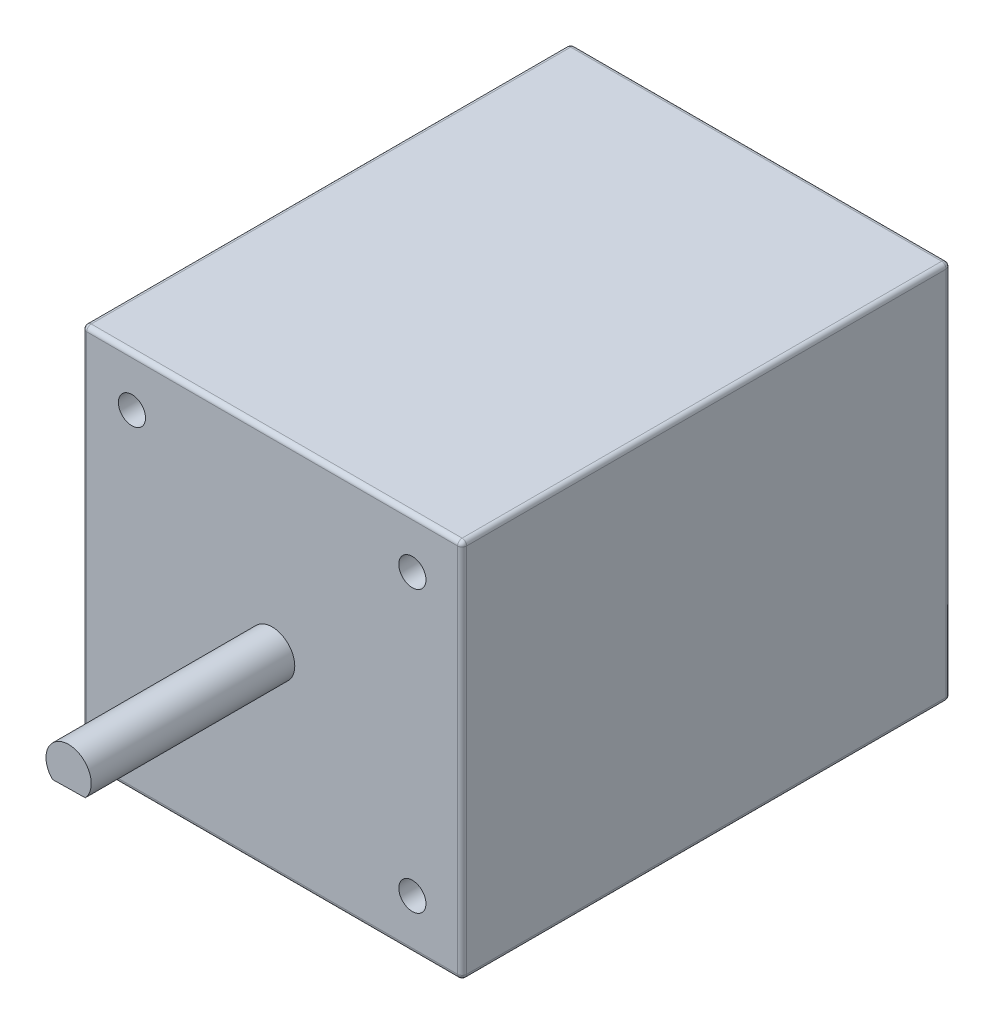
ISO-10303-21;
HEADER;
FILE_DESCRIPTION(('STEP AP214'),'2;1');
FILE_NAME('part.step','',(''),(''),'','','');
FILE_SCHEMA(('AUTOMOTIVE_DESIGN { 1 0 10303 214 1 1 1 1 }'));
ENDSEC;
DATA;
#1=APPLICATION_CONTEXT('core data for automotive mechanical design processes');
#2=APPLICATION_PROTOCOL_DEFINITION('international standard','automotive_design',2000,#1);
#3=PRODUCT_CONTEXT('',#1,'mechanical');
#4=PRODUCT('Part','Part','',(#3));
#5=PRODUCT_RELATED_PRODUCT_CATEGORY('part','',(#4));
#6=PRODUCT_DEFINITION_FORMATION('','',#4);
#7=PRODUCT_DEFINITION_CONTEXT('part definition',#1,'design');
#8=PRODUCT_DEFINITION('design','',#6,#7);
#9=PRODUCT_DEFINITION_SHAPE('','',#8);
#10=(LENGTH_UNIT() NAMED_UNIT(*) SI_UNIT(.MILLI.,.METRE.));
#11=(NAMED_UNIT(*) PLANE_ANGLE_UNIT() SI_UNIT($,.RADIAN.));
#12=(NAMED_UNIT(*) SI_UNIT($,.STERADIAN.) SOLID_ANGLE_UNIT());
#13=UNCERTAINTY_MEASURE_WITH_UNIT(LENGTH_MEASURE(1.E-05),#10,'distance_accuracy_value','');
#14=(GEOMETRIC_REPRESENTATION_CONTEXT(3) GLOBAL_UNCERTAINTY_ASSIGNED_CONTEXT((#13)) GLOBAL_UNIT_ASSIGNED_CONTEXT((#10,
#11,#12)) REPRESENTATION_CONTEXT('',''));
#15=CARTESIAN_POINT('',(0.,0.,0.));
#16=DIRECTION('',(0.,0.,1.));
#17=DIRECTION('',(1.,0.,0.));
#18=AXIS2_PLACEMENT_3D('',#15,#16,#17);
#19=CARTESIAN_POINT('',(21.,-21.,54.));
#20=DIRECTION('',(-1.,0.,0.));
#21=DIRECTION('',(0.,0.,1.));
#22=AXIS2_PLACEMENT_3D('',#19,#20,#21);
#23=PLANE('',#22);
#24=DIRECTION('',(0.,1.,0.));
#25=VECTOR('',#24,1.);
#26=CARTESIAN_POINT('',(21.,-21.,53.5));
#27=LINE('',#26,#25);
#28=CARTESIAN_POINT('',(21.,20.5,53.5));
#29=VERTEX_POINT('',#28);
#30=CARTESIAN_POINT('',(21.,-20.5,53.5));
#31=VERTEX_POINT('',#30);
#32=EDGE_CURVE('E182',#29,#31,#27,.F.);
#33=ORIENTED_EDGE('',*,*,#32,.T.);
#34=DIRECTION('',(0.,0.,-1.));
#35=VECTOR('',#34,1.);
#36=CARTESIAN_POINT('',(21.,-20.5,54.));
#37=LINE('',#36,#35);
#38=CARTESIAN_POINT('',(21.,-20.5,0.5));
#39=VERTEX_POINT('',#38);
#40=EDGE_CURVE('E185',#31,#39,#37,.T.);
#41=ORIENTED_EDGE('',*,*,#40,.T.);
#42=DIRECTION('',(0.,1.,0.));
#43=VECTOR('',#42,1.);
#44=CARTESIAN_POINT('',(21.,21.,0.5));
#45=LINE('',#44,#43);
#46=CARTESIAN_POINT('',(21.,20.5,0.5));
#47=VERTEX_POINT('',#46);
#48=EDGE_CURVE('E180',#39,#47,#45,.T.);
#49=ORIENTED_EDGE('',*,*,#48,.T.);
#50=DIRECTION('',(0.,0.,-1.));
#51=VECTOR('',#50,1.);
#52=CARTESIAN_POINT('',(21.,20.5,54.));
#53=LINE('',#52,#51);
#54=EDGE_CURVE('E178',#47,#29,#53,.F.);
#55=ORIENTED_EDGE('',*,*,#54,.T.);
#56=EDGE_LOOP('',(#33,#41,#49,#55));
#57=FACE_BOUND('',#56,.T.);
#58=ADVANCED_FACE('F41',(#57),#23,.F.);
#59=CARTESIAN_POINT('',(-21.,21.,54.));
#60=DIRECTION('',(0.,-1.,0.));
#61=DIRECTION('',(0.,0.,-1.));
#62=AXIS2_PLACEMENT_3D('',#59,#60,#61);
#63=PLANE('',#62);
#64=DIRECTION('',(-1.,0.,0.));
#65=VECTOR('',#64,1.);
#66=CARTESIAN_POINT('',(-21.,21.,53.5));
#67=LINE('',#66,#65);
#68=CARTESIAN_POINT('',(-20.5,21.,53.5));
#69=VERTEX_POINT('',#68);
#70=CARTESIAN_POINT('',(20.5,21.,53.5));
#71=VERTEX_POINT('',#70);
#72=EDGE_CURVE('E50',#69,#71,#67,.F.);
#73=ORIENTED_EDGE('',*,*,#72,.T.);
#74=DIRECTION('',(0.,0.,-1.));
#75=VECTOR('',#74,1.);
#76=CARTESIAN_POINT('',(20.5,21.,54.));
#77=LINE('',#76,#75);
#78=CARTESIAN_POINT('',(20.5,21.,0.5));
#79=VERTEX_POINT('',#78);
#80=EDGE_CURVE('E11',#71,#79,#77,.T.);
#81=ORIENTED_EDGE('',*,*,#80,.T.);
#82=DIRECTION('',(-1.,0.,0.));
#83=VECTOR('',#82,1.);
#84=CARTESIAN_POINT('',(-21.,21.,0.5));
#85=LINE('',#84,#83);
#86=CARTESIAN_POINT('',(-20.5,21.,0.5));
#87=VERTEX_POINT('',#86);
#88=EDGE_CURVE('E214',#79,#87,#85,.T.);
#89=ORIENTED_EDGE('',*,*,#88,.T.);
#90=DIRECTION('',(0.,0.,-1.));
#91=VECTOR('',#90,1.);
#92=CARTESIAN_POINT('',(-20.5,21.,54.));
#93=LINE('',#92,#91);
#94=EDGE_CURVE('E61',#87,#69,#93,.F.);
#95=ORIENTED_EDGE('',*,*,#94,.T.);
#96=EDGE_LOOP('',(#73,#81,#89,#95));
#97=FACE_BOUND('',#96,.T.);
#98=ADVANCED_FACE('F364',(#97),#63,.F.);
#99=CARTESIAN_POINT('',(-21.,-21.,54.));
#100=DIRECTION('',(1.,0.,0.));
#101=DIRECTION('',(0.,0.,-1.));
#102=AXIS2_PLACEMENT_3D('',#99,#100,#101);
#103=PLANE('',#102);
#104=DIRECTION('',(0.,0.,-1.));
#105=VECTOR('',#104,1.);
#106=CARTESIAN_POINT('',(-21.,-20.5,54.));
#107=LINE('',#106,#105);
#108=CARTESIAN_POINT('',(-21.,-20.5,0.5));
#109=VERTEX_POINT('',#108);
#110=CARTESIAN_POINT('',(-21.,-20.5,53.5));
#111=VERTEX_POINT('',#110);
#112=EDGE_CURVE('E209',#109,#111,#107,.F.);
#113=ORIENTED_EDGE('',*,*,#112,.T.);
#114=DIRECTION('',(0.,-1.,0.));
#115=VECTOR('',#114,1.);
#116=CARTESIAN_POINT('',(-21.,-21.,53.5));
#117=LINE('',#116,#115);
#118=CARTESIAN_POINT('',(-21.,20.5,53.5));
#119=VERTEX_POINT('',#118);
#120=EDGE_CURVE('E211',#111,#119,#117,.F.);
#121=ORIENTED_EDGE('',*,*,#120,.T.);
#122=DIRECTION('',(0.,0.,-1.));
#123=VECTOR('',#122,1.);
#124=CARTESIAN_POINT('',(-21.,20.5,54.));
#125=LINE('',#124,#123);
#126=CARTESIAN_POINT('',(-21.,20.5,0.5));
#127=VERTEX_POINT('',#126);
#128=EDGE_CURVE('E205',#119,#127,#125,.T.);
#129=ORIENTED_EDGE('',*,*,#128,.T.);
#130=DIRECTION('',(0.,-1.,0.));
#131=VECTOR('',#130,1.);
#132=CARTESIAN_POINT('',(-21.,-21.,0.5));
#133=LINE('',#132,#131);
#134=EDGE_CURVE('E207',#127,#109,#133,.T.);
#135=ORIENTED_EDGE('',*,*,#134,.T.);
#136=EDGE_LOOP('',(#113,#121,#129,#135));
#137=FACE_BOUND('',#136,.T.);
#138=ADVANCED_FACE('F310',(#137),#103,.F.);
#139=CARTESIAN_POINT('',(-21.,-21.,54.));
#140=DIRECTION('',(0.,1.,0.));
#141=DIRECTION('',(0.,0.,1.));
#142=AXIS2_PLACEMENT_3D('',#139,#140,#141);
#143=PLANE('',#142);
#144=DIRECTION('',(0.,0.,-1.));
#145=VECTOR('',#144,1.);
#146=CARTESIAN_POINT('',(20.5,-21.,54.));
#147=LINE('',#146,#145);
#148=CARTESIAN_POINT('',(20.5,-21.,0.5));
#149=VERTEX_POINT('',#148);
#150=CARTESIAN_POINT('',(20.5,-21.,53.5));
#151=VERTEX_POINT('',#150);
#152=EDGE_CURVE('E200',#149,#151,#147,.F.);
#153=ORIENTED_EDGE('',*,*,#152,.T.);
#154=DIRECTION('',(1.,0.,0.));
#155=VECTOR('',#154,1.);
#156=CARTESIAN_POINT('',(-21.,-21.,53.5));
#157=LINE('',#156,#155);
#158=CARTESIAN_POINT('',(-20.5,-21.,53.5));
#159=VERTEX_POINT('',#158);
#160=EDGE_CURVE('E202',#151,#159,#157,.F.);
#161=ORIENTED_EDGE('',*,*,#160,.T.);
#162=DIRECTION('',(0.,0.,-1.));
#163=VECTOR('',#162,1.);
#164=CARTESIAN_POINT('',(-20.5,-21.,54.));
#165=LINE('',#164,#163);
#166=CARTESIAN_POINT('',(-20.5,-21.,0.5));
#167=VERTEX_POINT('',#166);
#168=EDGE_CURVE('E196',#159,#167,#165,.T.);
#169=ORIENTED_EDGE('',*,*,#168,.T.);
#170=DIRECTION('',(1.,0.,0.));
#171=VECTOR('',#170,1.);
#172=CARTESIAN_POINT('',(21.,-21.,0.5));
#173=LINE('',#172,#171);
#174=EDGE_CURVE('E198',#167,#149,#173,.T.);
#175=ORIENTED_EDGE('',*,*,#174,.T.);
#176=EDGE_LOOP('',(#153,#161,#169,#175));
#177=FACE_BOUND('',#176,.T.);
#178=ADVANCED_FACE('F301',(#177),#143,.F.);
#179=CARTESIAN_POINT('',(0.,0.,54.));
#180=DIRECTION('',(0.,0.,-1.));
#181=DIRECTION('',(-1.,0.,0.));
#182=AXIS2_PLACEMENT_3D('',#179,#180,#181);
#183=PLANE('',#182);
#184=CARTESIAN_POINT('',(-15.5000000000002,-15.4999999999998,54.));
#185=DIRECTION('',(0.,0.,-1.));
#186=DIRECTION('',(-1.,0.,0.));
#187=AXIS2_PLACEMENT_3D('',#184,#185,#186);
#188=CIRCLE('',#187,1.5);
#189=CARTESIAN_POINT('',(-17.0000000000002,-15.4999999999998,54.));
#190=VERTEX_POINT('',#189);
#191=EDGE_CURVE('E691',#190,#190,#188,.T.);
#192=ORIENTED_EDGE('',*,*,#191,.T.);
#193=EDGE_LOOP('',(#192));
#194=FACE_BOUND('',#193,.T.);
#195=CARTESIAN_POINT('',(15.4999999999999,-15.5000000000001,54.));
#196=DIRECTION('',(0.,0.,-1.));
#197=DIRECTION('',(-1.,0.,0.));
#198=AXIS2_PLACEMENT_3D('',#195,#196,#197);
#199=CIRCLE('',#198,1.5);
#200=CARTESIAN_POINT('',(13.9999999999999,-15.5000000000001,54.));
#201=VERTEX_POINT('',#200);
#202=EDGE_CURVE('E708',#201,#201,#199,.T.);
#203=ORIENTED_EDGE('',*,*,#202,.T.);
#204=EDGE_LOOP('',(#203));
#205=FACE_BOUND('',#204,.T.);
#206=CARTESIAN_POINT('',(15.5000000000001,15.4999999999999,54.));
#207=DIRECTION('',(0.,0.,-1.));
#208=DIRECTION('',(-1.,0.,0.));
#209=AXIS2_PLACEMENT_3D('',#206,#207,#208);
#210=CIRCLE('',#209,1.5);
#211=CARTESIAN_POINT('',(14.0000000000001,15.4999999999999,54.));
#212=VERTEX_POINT('',#211);
#213=EDGE_CURVE('E699',#212,#212,#210,.T.);
#214=ORIENTED_EDGE('',*,*,#213,.T.);
#215=EDGE_LOOP('',(#214));
#216=FACE_BOUND('',#215,.T.);
#217=CARTESIAN_POINT('',(-15.5,15.5,54.));
#218=DIRECTION('',(0.,0.,-1.));
#219=DIRECTION('',(-1.,0.,0.));
#220=AXIS2_PLACEMENT_3D('',#217,#218,#219);
#221=CIRCLE('',#220,1.5);
#222=CARTESIAN_POINT('',(-17.,15.5,54.));
#223=VERTEX_POINT('',#222);
#224=EDGE_CURVE('E164',#223,#223,#221,.T.);
#225=ORIENTED_EDGE('',*,*,#224,.T.);
#226=EDGE_LOOP('',(#225));
#227=FACE_BOUND('',#226,.T.);
#228=DIRECTION('',(1.,0.,0.));
#229=VECTOR('',#228,1.);
#230=CARTESIAN_POINT('',(0.,-20.5,54.));
#231=LINE('',#230,#229);
#232=CARTESIAN_POINT('',(-20.5,-20.5,54.));
#233=VERTEX_POINT('',#232);
#234=CARTESIAN_POINT('',(20.5,-20.5,54.));
#235=VERTEX_POINT('',#234);
#236=EDGE_CURVE('E173',#233,#235,#231,.T.);
#237=ORIENTED_EDGE('',*,*,#236,.T.);
#238=DIRECTION('',(0.,1.,0.));
#239=VECTOR('',#238,1.);
#240=CARTESIAN_POINT('',(20.5,0.,54.));
#241=LINE('',#240,#239);
#242=CARTESIAN_POINT('',(20.5,20.5,54.));
#243=VERTEX_POINT('',#242);
#244=EDGE_CURVE('E175',#235,#243,#241,.T.);
#245=ORIENTED_EDGE('',*,*,#244,.T.);
#246=DIRECTION('',(-1.,0.,0.));
#247=VECTOR('',#246,1.);
#248=CARTESIAN_POINT('',(0.,20.5,54.));
#249=LINE('',#248,#247);
#250=CARTESIAN_POINT('',(-20.5,20.5,54.));
#251=VERTEX_POINT('',#250);
#252=EDGE_CURVE('E168',#243,#251,#249,.T.);
#253=ORIENTED_EDGE('',*,*,#252,.T.);
#254=DIRECTION('',(0.,-1.,0.));
#255=VECTOR('',#254,1.);
#256=CARTESIAN_POINT('',(-20.5,0.,54.));
#257=LINE('',#256,#255);
#258=EDGE_CURVE('E171',#251,#233,#257,.T.);
#259=ORIENTED_EDGE('',*,*,#258,.T.);
#260=EDGE_LOOP('',(#237,#245,#253,#259));
#261=FACE_BOUND('',#260,.T.);
#262=DIRECTION('',(0.99985468087506,0.0170474963626072,0.));
#263=VECTOR('',#262,1.);
#264=CARTESIAN_POINT('',(0.0293014268392263,-1.71856137454766,54.));
#265=LINE('',#264,#263);
#266=CARTESIAN_POINT('',(-1.78583780882188,-1.74950945141267,54.));
#267=VERTEX_POINT('',#266);
#268=CARTESIAN_POINT('',(1.84444066250034,-1.68761329768266,54.));
#269=VERTEX_POINT('',#268);
#270=EDGE_CURVE('E154',#267,#269,#265,.T.);
#271=ORIENTED_EDGE('',*,*,#270,.F.);
#272=CARTESIAN_POINT('',(0.,0.,54.));
#273=DIRECTION('',(0.,0.,-1.));
#274=DIRECTION('',(-1.,0.,0.));
#275=AXIS2_PLACEMENT_3D('',#272,#273,#274);
#276=CIRCLE('',#275,2.5);
#277=EDGE_CURVE('E161',#267,#269,#276,.T.);
#278=ORIENTED_EDGE('',*,*,#277,.T.);
#279=EDGE_LOOP('',(#271,#278));
#280=FACE_BOUND('',#279,.T.);
#281=ADVANCED_FACE('F408',(#194,#205,#216,#227,#261,#280),#183,.F.);
#282=CARTESIAN_POINT('',(0.,0.,0.));
#283=DIRECTION('',(0.,0.,-1.));
#284=DIRECTION('',(-1.,0.,0.));
#285=AXIS2_PLACEMENT_3D('',#282,#283,#284);
#286=PLANE('',#285);
#287=DIRECTION('',(-1.,0.,0.));
#288=VECTOR('',#287,1.);
#289=CARTESIAN_POINT('',(21.,20.5,0.));
#290=LINE('',#289,#288);
#291=CARTESIAN_POINT('',(-20.5,20.5,0.));
#292=VERTEX_POINT('',#291);
#293=CARTESIAN_POINT('',(20.5,20.5,0.));
#294=VERTEX_POINT('',#293);
#295=EDGE_CURVE('E187',#292,#294,#290,.F.);
#296=ORIENTED_EDGE('',*,*,#295,.T.);
#297=DIRECTION('',(0.,1.,0.));
#298=VECTOR('',#297,1.);
#299=CARTESIAN_POINT('',(20.5,-21.,0.));
#300=LINE('',#299,#298);
#301=CARTESIAN_POINT('',(20.5,-20.5,0.));
#302=VERTEX_POINT('',#301);
#303=EDGE_CURVE('E193',#294,#302,#300,.F.);
#304=ORIENTED_EDGE('',*,*,#303,.T.);
#305=DIRECTION('',(1.,0.,0.));
#306=VECTOR('',#305,1.);
#307=CARTESIAN_POINT('',(-21.,-20.5,0.));
#308=LINE('',#307,#306);
#309=CARTESIAN_POINT('',(-20.5,-20.5,0.));
#310=VERTEX_POINT('',#309);
#311=EDGE_CURVE('E191',#302,#310,#308,.F.);
#312=ORIENTED_EDGE('',*,*,#311,.T.);
#313=DIRECTION('',(0.,-1.,0.));
#314=VECTOR('',#313,1.);
#315=CARTESIAN_POINT('',(-20.5,21.,0.));
#316=LINE('',#315,#314);
#317=EDGE_CURVE('E189',#310,#292,#316,.F.);
#318=ORIENTED_EDGE('',*,*,#317,.T.);
#319=EDGE_LOOP('',(#296,#304,#312,#318));
#320=FACE_BOUND('',#319,.T.);
#321=ADVANCED_FACE('F330',(#320),#286,.T.);
#322=CARTESIAN_POINT('',(0.,0.,76.5));
#323=DIRECTION('',(0.,0.,-1.));
#324=DIRECTION('',(-1.,0.,0.));
#325=AXIS2_PLACEMENT_3D('',#322,#323,#324);
#326=CYLINDRICAL_SURFACE('',#325,2.5);
#327=ORIENTED_EDGE('',*,*,#277,.F.);
#328=DIRECTION('',(0.,0.,-1.));
#329=VECTOR('',#328,1.);
#330=CARTESIAN_POINT('',(-1.78583780882188,-1.74950945141267,76.5));
#331=LINE('',#330,#329);
#332=CARTESIAN_POINT('',(-1.78583780882188,-1.74950945141267,76.5));
#333=VERTEX_POINT('',#332);
#334=EDGE_CURVE('E157',#333,#267,#331,.T.);
#335=ORIENTED_EDGE('',*,*,#334,.F.);
#336=CARTESIAN_POINT('',(0.,0.,76.5));
#337=DIRECTION('',(0.,0.,-1.));
#338=DIRECTION('',(-1.,0.,0.));
#339=AXIS2_PLACEMENT_3D('',#336,#337,#338);
#340=CIRCLE('',#339,2.5);
#341=CARTESIAN_POINT('',(1.84444066250034,-1.68761329768266,76.5));
#342=VERTEX_POINT('',#341);
#343=EDGE_CURVE('E146',#333,#342,#340,.T.);
#344=ORIENTED_EDGE('',*,*,#343,.T.);
#345=DIRECTION('',(0.,0.,-1.));
#346=VECTOR('',#345,1.);
#347=CARTESIAN_POINT('',(1.84444066250034,-1.68761329768266,76.5));
#348=LINE('',#347,#346);
#349=EDGE_CURVE('E149',#342,#269,#348,.T.);
#350=ORIENTED_EDGE('',*,*,#349,.T.);
#351=EDGE_LOOP('',(#327,#335,#344,#350));
#352=FACE_BOUND('',#351,.T.);
#353=ADVANCED_FACE('F159',(#352),#326,.T.);
#354=CARTESIAN_POINT('',(0.0293014268392263,-1.71856137454766,76.5));
#355=DIRECTION('',(-0.0170474963626072,0.999854680875059,0.));
#356=DIRECTION('',(-0.99985468087506,-0.0170474963626072,0.));
#357=AXIS2_PLACEMENT_3D('',#354,#355,#356);
#358=PLANE('',#357);
#359=ORIENTED_EDGE('',*,*,#270,.T.);
#360=ORIENTED_EDGE('',*,*,#349,.F.);
#361=DIRECTION('',(0.99985468087506,0.0170474963626072,0.));
#362=VECTOR('',#361,1.);
#363=CARTESIAN_POINT('',(0.0293014268392263,-1.71856137454766,76.5));
#364=LINE('',#363,#362);
#365=EDGE_CURVE('E142',#333,#342,#364,.T.);
#366=ORIENTED_EDGE('',*,*,#365,.F.);
#367=ORIENTED_EDGE('',*,*,#334,.T.);
#368=EDGE_LOOP('',(#359,#360,#366,#367));
#369=FACE_BOUND('',#368,.T.);
#370=ADVANCED_FACE('F153',(#369),#358,.F.);
#371=CARTESIAN_POINT('',(0.,0.,76.5));
#372=DIRECTION('',(0.,0.,-1.));
#373=DIRECTION('',(-1.,0.,0.));
#374=AXIS2_PLACEMENT_3D('',#371,#372,#373);
#375=PLANE('',#374);
#376=ORIENTED_EDGE('',*,*,#343,.F.);
#377=ORIENTED_EDGE('',*,*,#365,.T.);
#378=EDGE_LOOP('',(#376,#377));
#379=FACE_BOUND('',#378,.T.);
#380=ADVANCED_FACE('F144',(#379),#375,.F.);
#381=CARTESIAN_POINT('',(-20.5,-21.,0.5));
#382=DIRECTION('',(0.,1.,0.));
#383=DIRECTION('',(0.,0.,1.));
#384=AXIS2_PLACEMENT_3D('',#381,#382,#383);
#385=CYLINDRICAL_SURFACE('',#384,0.5);
#386=CARTESIAN_POINT('',(-20.5,-20.5,0.5));
#387=DIRECTION('',(0.,-1.,0.));
#388=DIRECTION('',(0.,0.,-1.));
#389=AXIS2_PLACEMENT_3D('',#386,#387,#388);
#390=CIRCLE('',#389,0.5);
#391=EDGE_CURVE('E45',#109,#310,#390,.T.);
#392=ORIENTED_EDGE('',*,*,#391,.F.);
#393=ORIENTED_EDGE('',*,*,#134,.F.);
#394=CARTESIAN_POINT('',(-20.5,20.5,0.5));
#395=DIRECTION('',(0.,1.,0.));
#396=DIRECTION('',(-1.,0.,0.));
#397=AXIS2_PLACEMENT_3D('',#394,#395,#396);
#398=CIRCLE('',#397,0.5);
#399=EDGE_CURVE('E278',#292,#127,#398,.T.);
#400=ORIENTED_EDGE('',*,*,#399,.F.);
#401=ORIENTED_EDGE('',*,*,#317,.F.);
#402=EDGE_LOOP('',(#392,#393,#400,#401));
#403=FACE_BOUND('',#402,.T.);
#404=ADVANCED_FACE('F43',(#403),#385,.T.);
#405=CARTESIAN_POINT('',(-20.5,-20.5,0.5));
#406=DIRECTION('',(0.,0.,-1.));
#407=DIRECTION('',(-1.,0.,0.));
#408=AXIS2_PLACEMENT_3D('',#405,#406,#407);
#409=SPHERICAL_SURFACE('',#408,0.5);
#410=CARTESIAN_POINT('',(-20.5,-20.5,0.5));
#411=DIRECTION('',(0.,0.,-1.));
#412=DIRECTION('',(-1.,0.,0.));
#413=AXIS2_PLACEMENT_3D('',#410,#411,#412);
#414=CIRCLE('',#413,0.5);
#415=EDGE_CURVE('E273',#109,#167,#414,.F.);
#416=ORIENTED_EDGE('',*,*,#415,.F.);
#417=ORIENTED_EDGE('',*,*,#391,.T.);
#418=CARTESIAN_POINT('',(-20.5,-20.5,0.5));
#419=DIRECTION('',(-1.,0.,0.));
#420=DIRECTION('',(0.,0.,1.));
#421=AXIS2_PLACEMENT_3D('',#418,#419,#420);
#422=CIRCLE('',#421,0.5);
#423=EDGE_CURVE('E276',#167,#310,#422,.F.);
#424=ORIENTED_EDGE('',*,*,#423,.F.);
#425=EDGE_LOOP('',(#416,#417,#424));
#426=FACE_BOUND('',#425,.T.);
#427=ADVANCED_FACE('F289',(#426),#409,.T.);
#428=CARTESIAN_POINT('',(-20.5,20.5,0.5));
#429=DIRECTION('',(-1.,0.,0.));
#430=DIRECTION('',(0.,-1.,0.));
#431=AXIS2_PLACEMENT_3D('',#428,#429,#430);
#432=SPHERICAL_SURFACE('',#431,0.5);
#433=CARTESIAN_POINT('',(-20.5,20.5,0.5));
#434=DIRECTION('',(-1.,0.,0.));
#435=DIRECTION('',(0.,0.,1.));
#436=AXIS2_PLACEMENT_3D('',#433,#434,#435);
#437=CIRCLE('',#436,0.5);
#438=EDGE_CURVE('E267',#292,#87,#437,.F.);
#439=ORIENTED_EDGE('',*,*,#438,.F.);
#440=ORIENTED_EDGE('',*,*,#399,.T.);
#441=CARTESIAN_POINT('',(-20.5,20.5,0.5));
#442=DIRECTION('',(0.,0.,-1.));
#443=DIRECTION('',(-1.,0.,0.));
#444=AXIS2_PLACEMENT_3D('',#441,#442,#443);
#445=CIRCLE('',#444,0.5);
#446=EDGE_CURVE('E270',#87,#127,#445,.F.);
#447=ORIENTED_EDGE('',*,*,#446,.F.);
#448=EDGE_LOOP('',(#439,#440,#447));
#449=FACE_BOUND('',#448,.T.);
#450=ADVANCED_FACE('F323',(#449),#432,.T.);
#451=CARTESIAN_POINT('',(-21.,-20.5,0.5));
#452=DIRECTION('',(-1.,0.,0.));
#453=DIRECTION('',(0.,0.,1.));
#454=AXIS2_PLACEMENT_3D('',#451,#452,#453);
#455=CYLINDRICAL_SURFACE('',#454,0.5);
#456=ORIENTED_EDGE('',*,*,#423,.T.);
#457=ORIENTED_EDGE('',*,*,#311,.F.);
#458=CARTESIAN_POINT('',(20.5,-20.5,0.5));
#459=DIRECTION('',(1.,0.,0.));
#460=DIRECTION('',(0.,0.,-1.));
#461=AXIS2_PLACEMENT_3D('',#458,#459,#460);
#462=CIRCLE('',#461,0.5);
#463=EDGE_CURVE('E262',#149,#302,#462,.T.);
#464=ORIENTED_EDGE('',*,*,#463,.F.);
#465=ORIENTED_EDGE('',*,*,#174,.F.);
#466=EDGE_LOOP('',(#456,#457,#464,#465));
#467=FACE_BOUND('',#466,.T.);
#468=ADVANCED_FACE('F297',(#467),#455,.T.);
#469=CARTESIAN_POINT('',(-20.5,-20.5,54.));
#470=DIRECTION('',(0.,0.,-1.));
#471=DIRECTION('',(-1.,0.,0.));
#472=AXIS2_PLACEMENT_3D('',#469,#470,#471);
#473=CYLINDRICAL_SURFACE('',#472,0.5);
#474=ORIENTED_EDGE('',*,*,#415,.T.);
#475=ORIENTED_EDGE('',*,*,#168,.F.);
#476=CARTESIAN_POINT('',(-20.5,-20.5,53.5));
#477=DIRECTION('',(0.,0.,1.));
#478=DIRECTION('',(1.,0.,0.));
#479=AXIS2_PLACEMENT_3D('',#476,#477,#478);
#480=CIRCLE('',#479,0.5);
#481=EDGE_CURVE('E259',#111,#159,#480,.T.);
#482=ORIENTED_EDGE('',*,*,#481,.F.);
#483=ORIENTED_EDGE('',*,*,#112,.F.);
#484=EDGE_LOOP('',(#474,#475,#482,#483));
#485=FACE_BOUND('',#484,.T.);
#486=ADVANCED_FACE('F307',(#485),#473,.T.);
#487=CARTESIAN_POINT('',(-20.5,0.,53.5));
#488=DIRECTION('',(0.,-1.,0.));
#489=DIRECTION('',(0.,0.,-1.));
#490=AXIS2_PLACEMENT_3D('',#487,#488,#489);
#491=CYLINDRICAL_SURFACE('',#490,0.5);
#492=CARTESIAN_POINT('',(-20.5,20.5,53.5));
#493=DIRECTION('',(0.,1.,0.));
#494=DIRECTION('',(0.,0.,1.));
#495=AXIS2_PLACEMENT_3D('',#492,#493,#494);
#496=CIRCLE('',#495,0.5);
#497=EDGE_CURVE('E253',#119,#251,#496,.T.);
#498=ORIENTED_EDGE('',*,*,#497,.F.);
#499=ORIENTED_EDGE('',*,*,#120,.F.);
#500=CARTESIAN_POINT('',(-20.5,-20.5,53.5));
#501=DIRECTION('',(0.,-1.,0.));
#502=DIRECTION('',(0.,0.,-1.));
#503=AXIS2_PLACEMENT_3D('',#500,#501,#502);
#504=CIRCLE('',#503,0.5);
#505=EDGE_CURVE('E256',#233,#111,#504,.T.);
#506=ORIENTED_EDGE('',*,*,#505,.F.);
#507=ORIENTED_EDGE('',*,*,#258,.F.);
#508=EDGE_LOOP('',(#498,#499,#506,#507));
#509=FACE_BOUND('',#508,.T.);
#510=ADVANCED_FACE('F314',(#509),#491,.T.);
#511=CARTESIAN_POINT('',(-20.5,20.5,54.));
#512=DIRECTION('',(0.,0.,-1.));
#513=DIRECTION('',(-1.,0.,0.));
#514=AXIS2_PLACEMENT_3D('',#511,#512,#513);
#515=CYLINDRICAL_SURFACE('',#514,0.5);
#516=ORIENTED_EDGE('',*,*,#446,.T.);
#517=ORIENTED_EDGE('',*,*,#128,.F.);
#518=CARTESIAN_POINT('',(-20.5,20.5,53.5));
#519=DIRECTION('',(0.,0.,1.));
#520=DIRECTION('',(1.,0.,0.));
#521=AXIS2_PLACEMENT_3D('',#518,#519,#520);
#522=CIRCLE('',#521,0.5);
#523=EDGE_CURVE('E251',#69,#119,#522,.T.);
#524=ORIENTED_EDGE('',*,*,#523,.F.);
#525=ORIENTED_EDGE('',*,*,#94,.F.);
#526=EDGE_LOOP('',(#516,#517,#524,#525));
#527=FACE_BOUND('',#526,.T.);
#528=ADVANCED_FACE('F321',(#527),#515,.T.);
#529=CARTESIAN_POINT('',(-21.,20.5,0.5));
#530=DIRECTION('',(1.,0.,0.));
#531=DIRECTION('',(0.,0.,-1.));
#532=AXIS2_PLACEMENT_3D('',#529,#530,#531);
#533=CYLINDRICAL_SURFACE('',#532,0.5);
#534=ORIENTED_EDGE('',*,*,#438,.T.);
#535=ORIENTED_EDGE('',*,*,#88,.F.);
#536=CARTESIAN_POINT('',(20.5,20.5,0.5));
#537=DIRECTION('',(1.,0.,0.));
#538=DIRECTION('',(0.,0.,-1.));
#539=AXIS2_PLACEMENT_3D('',#536,#537,#538);
#540=CIRCLE('',#539,0.5);
#541=EDGE_CURVE('E248',#294,#79,#540,.T.);
#542=ORIENTED_EDGE('',*,*,#541,.F.);
#543=ORIENTED_EDGE('',*,*,#295,.F.);
#544=EDGE_LOOP('',(#534,#535,#542,#543));
#545=FACE_BOUND('',#544,.T.);
#546=ADVANCED_FACE('F327',(#545),#533,.T.);
#547=CARTESIAN_POINT('',(20.5,-21.,0.5));
#548=DIRECTION('',(0.,-1.,0.));
#549=DIRECTION('',(0.,0.,-1.));
#550=AXIS2_PLACEMENT_3D('',#547,#548,#549);
#551=CYLINDRICAL_SURFACE('',#550,0.5);
#552=CARTESIAN_POINT('',(20.5,-20.5,0.5));
#553=DIRECTION('',(0.,-1.,0.));
#554=DIRECTION('',(0.,0.,-1.));
#555=AXIS2_PLACEMENT_3D('',#552,#553,#554);
#556=CIRCLE('',#555,0.5);
#557=EDGE_CURVE('E264',#302,#39,#556,.T.);
#558=ORIENTED_EDGE('',*,*,#557,.F.);
#559=ORIENTED_EDGE('',*,*,#303,.F.);
#560=CARTESIAN_POINT('',(20.5,20.5,0.5));
#561=DIRECTION('',(0.,1.,0.));
#562=DIRECTION('',(0.,0.,1.));
#563=AXIS2_PLACEMENT_3D('',#560,#561,#562);
#564=CIRCLE('',#563,0.5);
#565=EDGE_CURVE('E245',#47,#294,#564,.T.);
#566=ORIENTED_EDGE('',*,*,#565,.F.);
#567=ORIENTED_EDGE('',*,*,#48,.F.);
#568=EDGE_LOOP('',(#558,#559,#566,#567));
#569=FACE_BOUND('',#568,.T.);
#570=ADVANCED_FACE('F334',(#569),#551,.T.);
#571=CARTESIAN_POINT('',(20.5,-20.5,0.5));
#572=DIRECTION('',(0.,0.,-1.));
#573=DIRECTION('',(-1.,0.,0.));
#574=AXIS2_PLACEMENT_3D('',#571,#572,#573);
#575=SPHERICAL_SURFACE('',#574,0.5);
#576=ORIENTED_EDGE('',*,*,#463,.T.);
#577=ORIENTED_EDGE('',*,*,#557,.T.);
#578=CARTESIAN_POINT('',(20.5,-20.5,0.5));
#579=DIRECTION('',(0.,0.,-1.));
#580=DIRECTION('',(-1.,0.,0.));
#581=AXIS2_PLACEMENT_3D('',#578,#579,#580);
#582=CIRCLE('',#581,0.5);
#583=EDGE_CURVE('E242',#149,#39,#582,.F.);
#584=ORIENTED_EDGE('',*,*,#583,.F.);
#585=EDGE_LOOP('',(#576,#577,#584));
#586=FACE_BOUND('',#585,.T.);
#587=ADVANCED_FACE('F338',(#586),#575,.T.);
#588=CARTESIAN_POINT('',(-20.5,-20.5,53.5));
#589=DIRECTION('',(-1.,0.,0.));
#590=DIRECTION('',(0.,0.,1.));
#591=AXIS2_PLACEMENT_3D('',#588,#589,#590);
#592=SPHERICAL_SURFACE('',#591,0.5);
#593=ORIENTED_EDGE('',*,*,#505,.T.);
#594=ORIENTED_EDGE('',*,*,#481,.T.);
#595=CARTESIAN_POINT('',(-20.5,-20.5,53.5));
#596=DIRECTION('',(-1.,0.,0.));
#597=DIRECTION('',(0.,0.,1.));
#598=AXIS2_PLACEMENT_3D('',#595,#596,#597);
#599=CIRCLE('',#598,0.5);
#600=EDGE_CURVE('E240',#233,#159,#599,.F.);
#601=ORIENTED_EDGE('',*,*,#600,.F.);
#602=EDGE_LOOP('',(#593,#594,#601));
#603=FACE_BOUND('',#602,.T.);
#604=ADVANCED_FACE('F352',(#603),#592,.T.);
#605=CARTESIAN_POINT('',(-20.5,20.5,53.5));
#606=DIRECTION('',(-1.,0.,0.));
#607=DIRECTION('',(0.,-1.,0.));
#608=AXIS2_PLACEMENT_3D('',#605,#606,#607);
#609=SPHERICAL_SURFACE('',#608,0.5);
#610=ORIENTED_EDGE('',*,*,#523,.T.);
#611=ORIENTED_EDGE('',*,*,#497,.T.);
#612=CARTESIAN_POINT('',(-20.5,20.5,53.5));
#613=DIRECTION('',(-1.,0.,0.));
#614=DIRECTION('',(0.,0.,1.));
#615=AXIS2_PLACEMENT_3D('',#612,#613,#614);
#616=CIRCLE('',#615,0.5);
#617=EDGE_CURVE('E237',#69,#251,#616,.F.);
#618=ORIENTED_EDGE('',*,*,#617,.F.);
#619=EDGE_LOOP('',(#610,#611,#618));
#620=FACE_BOUND('',#619,.T.);
#621=ADVANCED_FACE('F354',(#620),#609,.T.);
#622=CARTESIAN_POINT('',(20.5,20.5,0.5));
#623=DIRECTION('',(0.,0.,-1.));
#624=DIRECTION('',(-1.,0.,0.));
#625=AXIS2_PLACEMENT_3D('',#622,#623,#624);
#626=SPHERICAL_SURFACE('',#625,0.5);
#627=ORIENTED_EDGE('',*,*,#565,.T.);
#628=ORIENTED_EDGE('',*,*,#541,.T.);
#629=CARTESIAN_POINT('',(20.5,20.5,0.5));
#630=DIRECTION('',(0.,0.,-1.));
#631=DIRECTION('',(-1.,0.,0.));
#632=AXIS2_PLACEMENT_3D('',#629,#630,#631);
#633=CIRCLE('',#632,0.5);
#634=EDGE_CURVE('E235',#47,#79,#633,.F.);
#635=ORIENTED_EDGE('',*,*,#634,.F.);
#636=EDGE_LOOP('',(#627,#628,#635));
#637=FACE_BOUND('',#636,.T.);
#638=ADVANCED_FACE('F360',(#637),#626,.T.);
#639=CARTESIAN_POINT('',(20.5,-20.5,54.));
#640=DIRECTION('',(0.,0.,-1.));
#641=DIRECTION('',(-1.,0.,0.));
#642=AXIS2_PLACEMENT_3D('',#639,#640,#641);
#643=CYLINDRICAL_SURFACE('',#642,0.5);
#644=ORIENTED_EDGE('',*,*,#583,.T.);
#645=ORIENTED_EDGE('',*,*,#40,.F.);
#646=CARTESIAN_POINT('',(20.5,-20.5,53.5));
#647=DIRECTION('',(0.,0.,1.));
#648=DIRECTION('',(1.,0.,0.));
#649=AXIS2_PLACEMENT_3D('',#646,#647,#648);
#650=CIRCLE('',#649,0.5);
#651=EDGE_CURVE('E232',#151,#31,#650,.T.);
#652=ORIENTED_EDGE('',*,*,#651,.F.);
#653=ORIENTED_EDGE('',*,*,#152,.F.);
#654=EDGE_LOOP('',(#644,#645,#652,#653));
#655=FACE_BOUND('',#654,.T.);
#656=ADVANCED_FACE('F341',(#655),#643,.T.);
#657=CARTESIAN_POINT('',(0.,-20.5,53.5));
#658=DIRECTION('',(1.,0.,0.));
#659=DIRECTION('',(0.,0.,-1.));
#660=AXIS2_PLACEMENT_3D('',#657,#658,#659);
#661=CYLINDRICAL_SURFACE('',#660,0.5);
#662=ORIENTED_EDGE('',*,*,#600,.T.);
#663=ORIENTED_EDGE('',*,*,#160,.F.);
#664=CARTESIAN_POINT('',(20.5,-20.5,53.5));
#665=DIRECTION('',(1.,0.,0.));
#666=DIRECTION('',(0.,0.,-1.));
#667=AXIS2_PLACEMENT_3D('',#664,#665,#666);
#668=CIRCLE('',#667,0.5);
#669=EDGE_CURVE('E229',#235,#151,#668,.T.);
#670=ORIENTED_EDGE('',*,*,#669,.F.);
#671=ORIENTED_EDGE('',*,*,#236,.F.);
#672=EDGE_LOOP('',(#662,#663,#670,#671));
#673=FACE_BOUND('',#672,.T.);
#674=ADVANCED_FACE('F350',(#673),#661,.T.);
#675=CARTESIAN_POINT('',(0.,20.5,53.5));
#676=DIRECTION('',(-1.,0.,0.));
#677=DIRECTION('',(0.,0.,1.));
#678=AXIS2_PLACEMENT_3D('',#675,#676,#677);
#679=CYLINDRICAL_SURFACE('',#678,0.5);
#680=ORIENTED_EDGE('',*,*,#617,.T.);
#681=ORIENTED_EDGE('',*,*,#252,.F.);
#682=CARTESIAN_POINT('',(20.5,20.5,53.5));
#683=DIRECTION('',(1.,0.,0.));
#684=DIRECTION('',(0.,0.,-1.));
#685=AXIS2_PLACEMENT_3D('',#682,#683,#684);
#686=CIRCLE('',#685,0.5);
#687=EDGE_CURVE('E226',#71,#243,#686,.T.);
#688=ORIENTED_EDGE('',*,*,#687,.F.);
#689=ORIENTED_EDGE('',*,*,#72,.F.);
#690=EDGE_LOOP('',(#680,#681,#688,#689));
#691=FACE_BOUND('',#690,.T.);
#692=ADVANCED_FACE('F388',(#691),#679,.T.);
#693=CARTESIAN_POINT('',(20.5,20.5,54.));
#694=DIRECTION('',(0.,0.,-1.));
#695=DIRECTION('',(-1.,0.,0.));
#696=AXIS2_PLACEMENT_3D('',#693,#694,#695);
#697=CYLINDRICAL_SURFACE('',#696,0.5);
#698=ORIENTED_EDGE('',*,*,#634,.T.);
#699=ORIENTED_EDGE('',*,*,#80,.F.);
#700=CARTESIAN_POINT('',(20.5,20.5,53.5));
#701=DIRECTION('',(0.,0.,1.));
#702=DIRECTION('',(1.,0.,0.));
#703=AXIS2_PLACEMENT_3D('',#700,#701,#702);
#704=CIRCLE('',#703,0.5);
#705=EDGE_CURVE('E223',#29,#71,#704,.T.);
#706=ORIENTED_EDGE('',*,*,#705,.F.);
#707=ORIENTED_EDGE('',*,*,#54,.F.);
#708=EDGE_LOOP('',(#698,#699,#706,#707));
#709=FACE_BOUND('',#708,.T.);
#710=ADVANCED_FACE('F385',(#709),#697,.T.);
#711=CARTESIAN_POINT('',(20.5,-20.5,53.5));
#712=DIRECTION('',(0.,-1.,0.));
#713=DIRECTION('',(0.,0.,-1.));
#714=AXIS2_PLACEMENT_3D('',#711,#712,#713);
#715=SPHERICAL_SURFACE('',#714,0.5);
#716=ORIENTED_EDGE('',*,*,#669,.T.);
#717=ORIENTED_EDGE('',*,*,#651,.T.);
#718=CARTESIAN_POINT('',(20.5,-20.5,53.5));
#719=DIRECTION('',(0.,-1.,0.));
#720=DIRECTION('',(0.,0.,-1.));
#721=AXIS2_PLACEMENT_3D('',#718,#719,#720);
#722=CIRCLE('',#721,0.5);
#723=EDGE_CURVE('E220',#235,#31,#722,.F.);
#724=ORIENTED_EDGE('',*,*,#723,.F.);
#725=EDGE_LOOP('',(#716,#717,#724));
#726=FACE_BOUND('',#725,.T.);
#727=ADVANCED_FACE('F346',(#726),#715,.T.);
#728=CARTESIAN_POINT('',(20.5,20.5,53.5));
#729=DIRECTION('',(0.,1.,0.));
#730=DIRECTION('',(0.,0.,1.));
#731=AXIS2_PLACEMENT_3D('',#728,#729,#730);
#732=SPHERICAL_SURFACE('',#731,0.5);
#733=ORIENTED_EDGE('',*,*,#705,.T.);
#734=ORIENTED_EDGE('',*,*,#687,.T.);
#735=CARTESIAN_POINT('',(20.5,20.5,53.5));
#736=DIRECTION('',(0.,1.,0.));
#737=DIRECTION('',(0.,0.,1.));
#738=AXIS2_PLACEMENT_3D('',#735,#736,#737);
#739=CIRCLE('',#738,0.5);
#740=EDGE_CURVE('E218',#29,#243,#739,.F.);
#741=ORIENTED_EDGE('',*,*,#740,.F.);
#742=EDGE_LOOP('',(#733,#734,#741));
#743=FACE_BOUND('',#742,.T.);
#744=ADVANCED_FACE('F378',(#743),#732,.T.);
#745=CARTESIAN_POINT('',(20.5,0.,53.5));
#746=DIRECTION('',(0.,1.,0.));
#747=DIRECTION('',(0.,0.,1.));
#748=AXIS2_PLACEMENT_3D('',#745,#746,#747);
#749=CYLINDRICAL_SURFACE('',#748,0.5);
#750=ORIENTED_EDGE('',*,*,#723,.T.);
#751=ORIENTED_EDGE('',*,*,#32,.F.);
#752=ORIENTED_EDGE('',*,*,#740,.T.);
#753=ORIENTED_EDGE('',*,*,#244,.F.);
#754=EDGE_LOOP('',(#750,#751,#752,#753));
#755=FACE_BOUND('',#754,.T.);
#756=ADVANCED_FACE('F374',(#755),#749,.T.);
#757=CARTESIAN_POINT('',(-15.5,15.5,44.));
#758=DIRECTION('',(0.,0.,1.));
#759=DIRECTION('',(1.,0.,0.));
#760=AXIS2_PLACEMENT_3D('',#757,#758,#759);
#761=CYLINDRICAL_SURFACE('',#760,1.5);
#762=CARTESIAN_POINT('',(-15.5,15.5,44.));
#763=DIRECTION('',(0.,0.,-1.));
#764=DIRECTION('',(-1.,0.,0.));
#765=AXIS2_PLACEMENT_3D('',#762,#763,#764);
#766=CIRCLE('',#765,1.5);
#767=CARTESIAN_POINT('',(-17.,15.5,44.));
#768=VERTEX_POINT('',#767);
#769=EDGE_CURVE('E221',#768,#768,#766,.T.);
#770=ORIENTED_EDGE('',*,*,#769,.T.);
#771=EDGE_LOOP('',(#770));
#772=FACE_BOUND('',#771,.T.);
#773=ORIENTED_EDGE('',*,*,#224,.F.);
#774=EDGE_LOOP('',(#773));
#775=FACE_BOUND('',#774,.T.);
#776=ADVANCED_FACE('F377',(#772,#775),#761,.F.);
#777=CARTESIAN_POINT('',(-15.5,15.5,44.));
#778=DIRECTION('',(0.,0.,-1.));
#779=DIRECTION('',(-1.,0.,0.));
#780=AXIS2_PLACEMENT_3D('',#777,#778,#779);
#781=PLANE('',#780);
#782=ORIENTED_EDGE('',*,*,#769,.F.);
#783=EDGE_LOOP('',(#782));
#784=FACE_BOUND('',#783,.T.);
#785=ADVANCED_FACE('F572',(#784),#781,.F.);
#786=CARTESIAN_POINT('',(15.5000000000001,15.4999999999999,44.));
#787=DIRECTION('',(0.,0.,1.));
#788=DIRECTION('',(1.,0.,0.));
#789=AXIS2_PLACEMENT_3D('',#786,#787,#788);
#790=CYLINDRICAL_SURFACE('',#789,1.5);
#791=CARTESIAN_POINT('',(15.5000000000001,15.4999999999999,44.));
#792=DIRECTION('',(0.,0.,-1.));
#793=DIRECTION('',(-1.,0.,0.));
#794=AXIS2_PLACEMENT_3D('',#791,#792,#793);
#795=CIRCLE('',#794,1.5);
#796=CARTESIAN_POINT('',(14.0000000000001,15.4999999999999,44.));
#797=VERTEX_POINT('',#796);
#798=EDGE_CURVE('E703',#797,#797,#795,.T.);
#799=ORIENTED_EDGE('',*,*,#798,.T.);
#800=EDGE_LOOP('',(#799));
#801=FACE_BOUND('',#800,.T.);
#802=ORIENTED_EDGE('',*,*,#213,.F.);
#803=EDGE_LOOP('',(#802));
#804=FACE_BOUND('',#803,.T.);
#805=ADVANCED_FACE('F582',(#801,#804),#790,.F.);
#806=CARTESIAN_POINT('',(15.5000000000001,15.4999999999999,44.));
#807=DIRECTION('',(0.,0.,-1.));
#808=DIRECTION('',(-1.,0.,0.));
#809=AXIS2_PLACEMENT_3D('',#806,#807,#808);
#810=PLANE('',#809);
#811=ORIENTED_EDGE('',*,*,#798,.F.);
#812=EDGE_LOOP('',(#811));
#813=FACE_BOUND('',#812,.T.);
#814=ADVANCED_FACE('F592',(#813),#810,.F.);
#815=CARTESIAN_POINT('',(15.4999999999999,-15.5000000000001,44.));
#816=DIRECTION('',(0.,0.,1.));
#817=DIRECTION('',(1.,0.,0.));
#818=AXIS2_PLACEMENT_3D('',#815,#816,#817);
#819=CYLINDRICAL_SURFACE('',#818,1.5);
#820=CARTESIAN_POINT('',(15.4999999999999,-15.5000000000001,44.));
#821=DIRECTION('',(0.,0.,-1.));
#822=DIRECTION('',(-1.,0.,0.));
#823=AXIS2_PLACEMENT_3D('',#820,#821,#822);
#824=CIRCLE('',#823,1.5);
#825=CARTESIAN_POINT('',(13.9999999999999,-15.5000000000001,44.));
#826=VERTEX_POINT('',#825);
#827=EDGE_CURVE('E693',#826,#826,#824,.T.);
#828=ORIENTED_EDGE('',*,*,#827,.T.);
#829=EDGE_LOOP('',(#828));
#830=FACE_BOUND('',#829,.T.);
#831=ORIENTED_EDGE('',*,*,#202,.F.);
#832=EDGE_LOOP('',(#831));
#833=FACE_BOUND('',#832,.T.);
#834=ADVANCED_FACE('F602',(#830,#833),#819,.F.);
#835=CARTESIAN_POINT('',(15.4999999999999,-15.5000000000001,44.));
#836=DIRECTION('',(0.,0.,-1.));
#837=DIRECTION('',(-1.,0.,0.));
#838=AXIS2_PLACEMENT_3D('',#835,#836,#837);
#839=PLANE('',#838);
#840=ORIENTED_EDGE('',*,*,#827,.F.);
#841=EDGE_LOOP('',(#840));
#842=FACE_BOUND('',#841,.T.);
#843=ADVANCED_FACE('F612',(#842),#839,.F.);
#844=CARTESIAN_POINT('',(-15.5000000000002,-15.4999999999998,44.));
#845=DIRECTION('',(0.,0.,1.));
#846=DIRECTION('',(1.,0.,0.));
#847=AXIS2_PLACEMENT_3D('',#844,#845,#846);
#848=CYLINDRICAL_SURFACE('',#847,1.5);
#849=CARTESIAN_POINT('',(-15.5000000000002,-15.4999999999998,44.));
#850=DIRECTION('',(0.,0.,-1.));
#851=DIRECTION('',(-1.,0.,0.));
#852=AXIS2_PLACEMENT_3D('',#849,#850,#851);
#853=CIRCLE('',#852,1.5);
#854=CARTESIAN_POINT('',(-17.0000000000002,-15.4999999999998,44.));
#855=VERTEX_POINT('',#854);
#856=EDGE_CURVE('E690',#855,#855,#853,.T.);
#857=ORIENTED_EDGE('',*,*,#856,.T.);
#858=EDGE_LOOP('',(#857));
#859=FACE_BOUND('',#858,.T.);
#860=ORIENTED_EDGE('',*,*,#191,.F.);
#861=EDGE_LOOP('',(#860));
#862=FACE_BOUND('',#861,.T.);
#863=ADVANCED_FACE('F622',(#859,#862),#848,.F.);
#864=CARTESIAN_POINT('',(-15.5000000000002,-15.4999999999998,44.));
#865=DIRECTION('',(0.,0.,-1.));
#866=DIRECTION('',(-1.,0.,0.));
#867=AXIS2_PLACEMENT_3D('',#864,#865,#866);
#868=PLANE('',#867);
#869=ORIENTED_EDGE('',*,*,#856,.F.);
#870=EDGE_LOOP('',(#869));
#871=FACE_BOUND('',#870,.T.);
#872=ADVANCED_FACE('F632',(#871),#868,.F.);
#873=CLOSED_SHELL('',(#58,#98,#138,#178,#281,#321,#353,#370,#380,#404,#427,#450,#468,#486,#510,
#528,#546,#570,#587,#604,#621,#638,#656,#674,#692,#710,#727,#744,#756,#776,#785,#805,#814,#834,
#843,#863,#872));
#874=MANIFOLD_SOLID_BREP('B2',#873);
#875=ADVANCED_BREP_SHAPE_REPRESENTATION('',(#18,#874),#14);
#876=SHAPE_DEFINITION_REPRESENTATION(#9,#875);
ENDSEC;
END-ISO-10303-21;
